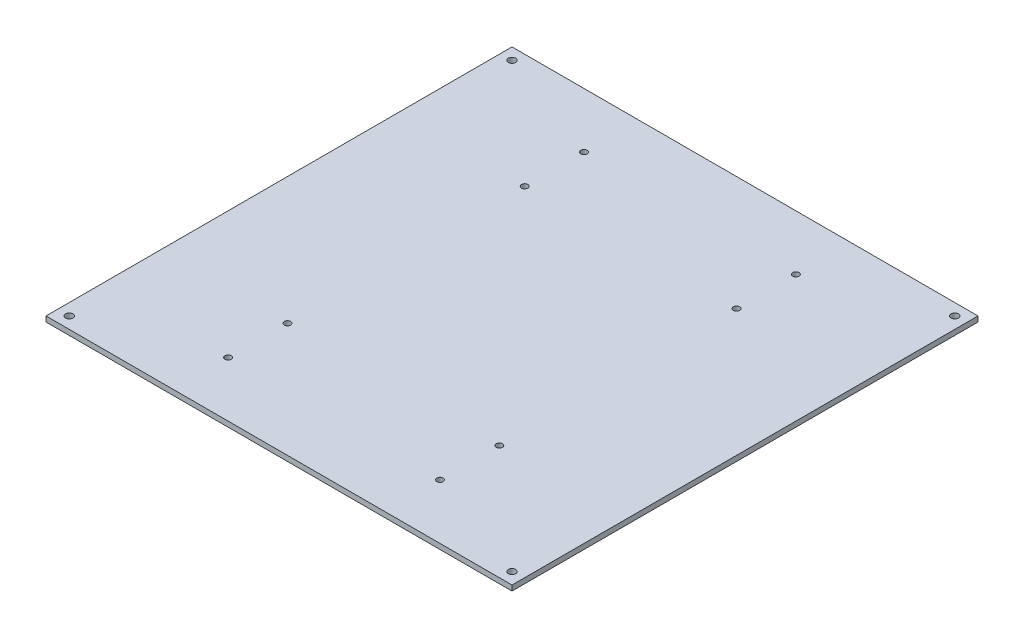
ISO-10303-21;
HEADER;
FILE_DESCRIPTION(('STEP AP214'),'2;1');
FILE_NAME('part.step','',(''),(''),'','','');
FILE_SCHEMA(('AUTOMOTIVE_DESIGN { 1 0 10303 214 1 1 1 1 }'));
ENDSEC;
DATA;
#1=APPLICATION_CONTEXT('core data for automotive mechanical design processes');
#2=APPLICATION_PROTOCOL_DEFINITION('international standard','automotive_design',2000,#1);
#3=PRODUCT_CONTEXT('',#1,'mechanical');
#4=PRODUCT('Part','Part','',(#3));
#5=PRODUCT_RELATED_PRODUCT_CATEGORY('part','',(#4));
#6=PRODUCT_DEFINITION_FORMATION('','',#4);
#7=PRODUCT_DEFINITION_CONTEXT('part definition',#1,'design');
#8=PRODUCT_DEFINITION('design','',#6,#7);
#9=PRODUCT_DEFINITION_SHAPE('','',#8);
#10=(LENGTH_UNIT() NAMED_UNIT(*) SI_UNIT(.MILLI.,.METRE.));
#11=(NAMED_UNIT(*) PLANE_ANGLE_UNIT() SI_UNIT($,.RADIAN.));
#12=(NAMED_UNIT(*) SI_UNIT($,.STERADIAN.) SOLID_ANGLE_UNIT());
#13=UNCERTAINTY_MEASURE_WITH_UNIT(LENGTH_MEASURE(1.E-05),#10,'distance_accuracy_value','');
#14=(GEOMETRIC_REPRESENTATION_CONTEXT(3) GLOBAL_UNCERTAINTY_ASSIGNED_CONTEXT((#13)) GLOBAL_UNIT_ASSIGNED_CONTEXT((#10,
#11,#12)) REPRESENTATION_CONTEXT('',''));
#15=CARTESIAN_POINT('',(0.,0.,0.));
#16=DIRECTION('',(0.,0.,1.));
#17=DIRECTION('',(1.,0.,0.));
#18=AXIS2_PLACEMENT_3D('',#15,#16,#17);
#19=CARTESIAN_POINT('',(0.,2.5,0.));
#20=DIRECTION('',(0.,-1.,0.));
#21=DIRECTION('',(0.,0.,-1.));
#22=AXIS2_PLACEMENT_3D('',#19,#20,#21);
#23=PLANE('',#22);
#24=CARTESIAN_POINT('',(60.,2.5,-54.));
#25=DIRECTION('',(0.,-1.,0.));
#26=DIRECTION('',(0.,0.,-1.));
#27=AXIS2_PLACEMENT_3D('',#24,#25,#26);
#28=CIRCLE('',#27,1.5);
#29=CARTESIAN_POINT('',(60.,2.5,-55.5));
#30=VERTEX_POINT('',#29);
#31=EDGE_CURVE('E146',#30,#30,#28,.T.);
#32=ORIENTED_EDGE('',*,*,#31,.T.);
#33=EDGE_LOOP('',(#32));
#34=FACE_BOUND('',#33,.T.);
#35=CARTESIAN_POINT('',(60.,2.5,-166.));
#36=DIRECTION('',(0.,-1.,0.));
#37=DIRECTION('',(0.,0.,1.));
#38=AXIS2_PLACEMENT_3D('',#35,#36,#37);
#39=CIRCLE('',#38,1.5);
#40=CARTESIAN_POINT('',(60.,2.5,-164.5));
#41=VERTEX_POINT('',#40);
#42=EDGE_CURVE('E165',#41,#41,#39,.T.);
#43=ORIENTED_EDGE('',*,*,#42,.T.);
#44=EDGE_LOOP('',(#43));
#45=FACE_BOUND('',#44,.T.);
#46=CARTESIAN_POINT('',(60.,2.5,-194.));
#47=DIRECTION('',(0.,-1.,0.));
#48=DIRECTION('',(0.,0.,1.));
#49=AXIS2_PLACEMENT_3D('',#46,#47,#48);
#50=CIRCLE('',#49,1.5);
#51=CARTESIAN_POINT('',(60.,2.5,-192.5));
#52=VERTEX_POINT('',#51);
#53=EDGE_CURVE('E159',#52,#52,#50,.T.);
#54=ORIENTED_EDGE('',*,*,#53,.T.);
#55=EDGE_LOOP('',(#54));
#56=FACE_BOUND('',#55,.T.);
#57=CARTESIAN_POINT('',(160.,2.5,-194.));
#58=DIRECTION('',(0.,-1.,0.));
#59=DIRECTION('',(0.,0.,-1.));
#60=AXIS2_PLACEMENT_3D('',#57,#58,#59);
#61=CIRCLE('',#60,1.5);
#62=CARTESIAN_POINT('',(160.,2.5,-195.5));
#63=VERTEX_POINT('',#62);
#64=EDGE_CURVE('E152',#63,#63,#61,.T.);
#65=ORIENTED_EDGE('',*,*,#64,.T.);
#66=EDGE_LOOP('',(#65));
#67=FACE_BOUND('',#66,.T.);
#68=CARTESIAN_POINT('',(160.,2.5,-166.));
#69=DIRECTION('',(0.,-1.,0.));
#70=DIRECTION('',(0.,0.,-1.));
#71=AXIS2_PLACEMENT_3D('',#68,#69,#70);
#72=CIRCLE('',#71,1.5);
#73=CARTESIAN_POINT('',(160.,2.5,-167.5));
#74=VERTEX_POINT('',#73);
#75=EDGE_CURVE('E153',#74,#74,#72,.T.);
#76=ORIENTED_EDGE('',*,*,#75,.T.);
#77=EDGE_LOOP('',(#76));
#78=FACE_BOUND('',#77,.T.);
#79=CARTESIAN_POINT('',(160.,2.5,-54.));
#80=DIRECTION('',(0.,-1.,0.));
#81=DIRECTION('',(0.,0.,1.));
#82=AXIS2_PLACEMENT_3D('',#79,#80,#81);
#83=CIRCLE('',#82,1.5);
#84=CARTESIAN_POINT('',(160.,2.5,-52.5));
#85=VERTEX_POINT('',#84);
#86=EDGE_CURVE('E182',#85,#85,#83,.T.);
#87=ORIENTED_EDGE('',*,*,#86,.T.);
#88=EDGE_LOOP('',(#87));
#89=FACE_BOUND('',#88,.T.);
#90=CARTESIAN_POINT('',(160.,2.5,-26.));
#91=DIRECTION('',(0.,-1.,0.));
#92=DIRECTION('',(0.,0.,1.));
#93=AXIS2_PLACEMENT_3D('',#90,#91,#92);
#94=CIRCLE('',#93,1.5);
#95=CARTESIAN_POINT('',(160.,2.5,-24.5));
#96=VERTEX_POINT('',#95);
#97=EDGE_CURVE('E176',#96,#96,#94,.T.);
#98=ORIENTED_EDGE('',*,*,#97,.T.);
#99=EDGE_LOOP('',(#98));
#100=FACE_BOUND('',#99,.T.);
#101=CARTESIAN_POINT('',(60.,2.5,-26.));
#102=DIRECTION('',(0.,-1.,0.));
#103=DIRECTION('',(0.,0.,-1.));
#104=AXIS2_PLACEMENT_3D('',#101,#102,#103);
#105=CIRCLE('',#104,1.5);
#106=CARTESIAN_POINT('',(60.,2.5,-27.5));
#107=VERTEX_POINT('',#106);
#108=EDGE_CURVE('E140',#107,#107,#105,.T.);
#109=ORIENTED_EDGE('',*,*,#108,.T.);
#110=EDGE_LOOP('',(#109));
#111=FACE_BOUND('',#110,.T.);
#112=DIRECTION('',(0.,0.,1.));
#113=VECTOR('',#112,1.);
#114=CARTESIAN_POINT('',(0.,2.5,0.));
#115=LINE('',#114,#113);
#116=CARTESIAN_POINT('',(0.,2.5,-220.));
#117=VERTEX_POINT('',#116);
#118=CARTESIAN_POINT('',(0.,2.5,0.));
#119=VERTEX_POINT('',#118);
#120=EDGE_CURVE('E92',#117,#119,#115,.T.);
#121=ORIENTED_EDGE('',*,*,#120,.T.);
#122=DIRECTION('',(1.,0.,0.));
#123=VECTOR('',#122,1.);
#124=CARTESIAN_POINT('',(0.,2.5,0.));
#125=LINE('',#124,#123);
#126=CARTESIAN_POINT('',(220.,2.5,0.));
#127=VERTEX_POINT('',#126);
#128=EDGE_CURVE('E87',#119,#127,#125,.T.);
#129=ORIENTED_EDGE('',*,*,#128,.T.);
#130=DIRECTION('',(0.,0.,-1.));
#131=VECTOR('',#130,1.);
#132=CARTESIAN_POINT('',(220.,2.5,0.));
#133=LINE('',#132,#131);
#134=CARTESIAN_POINT('',(220.,2.5,-220.));
#135=VERTEX_POINT('',#134);
#136=EDGE_CURVE('E90',#127,#135,#133,.T.);
#137=ORIENTED_EDGE('',*,*,#136,.T.);
#138=DIRECTION('',(-1.,0.,0.));
#139=VECTOR('',#138,1.);
#140=CARTESIAN_POINT('',(0.,2.5,-220.));
#141=LINE('',#140,#139);
#142=EDGE_CURVE('E57',#135,#117,#141,.T.);
#143=ORIENTED_EDGE('',*,*,#142,.T.);
#144=EDGE_LOOP('',(#121,#129,#137,#143));
#145=FACE_BOUND('',#144,.T.);
#146=CARTESIAN_POINT('',(5.50000000000003,2.5,-5.49999999999999));
#147=DIRECTION('',(0.,1.,0.));
#148=DIRECTION('',(0.,0.,1.));
#149=AXIS2_PLACEMENT_3D('',#146,#147,#148);
#150=CIRCLE('',#149,1.75);
#151=CARTESIAN_POINT('',(5.50000000000003,2.5,-3.74999999999999));
#152=VERTEX_POINT('',#151);
#153=EDGE_CURVE('E107',#152,#152,#150,.T.);
#154=ORIENTED_EDGE('',*,*,#153,.F.);
#155=EDGE_LOOP('',(#154));
#156=FACE_BOUND('',#155,.T.);
#157=CARTESIAN_POINT('',(214.5,2.5,-5.50000000000001));
#158=DIRECTION('',(0.,1.,0.));
#159=DIRECTION('',(0.,0.,1.));
#160=AXIS2_PLACEMENT_3D('',#157,#158,#159);
#161=CIRCLE('',#160,1.75000000000001);
#162=CARTESIAN_POINT('',(214.5,2.5,-3.74999999999999));
#163=VERTEX_POINT('',#162);
#164=EDGE_CURVE('E122',#163,#163,#161,.T.);
#165=ORIENTED_EDGE('',*,*,#164,.F.);
#166=EDGE_LOOP('',(#165));
#167=FACE_BOUND('',#166,.T.);
#168=CARTESIAN_POINT('',(214.5,2.5,-214.5));
#169=DIRECTION('',(0.,1.,0.));
#170=DIRECTION('',(0.,0.,1.));
#171=AXIS2_PLACEMENT_3D('',#168,#169,#170);
#172=CIRCLE('',#171,1.75000000000001);
#173=CARTESIAN_POINT('',(214.5,2.5,-212.75));
#174=VERTEX_POINT('',#173);
#175=EDGE_CURVE('E128',#174,#174,#172,.T.);
#176=ORIENTED_EDGE('',*,*,#175,.F.);
#177=EDGE_LOOP('',(#176));
#178=FACE_BOUND('',#177,.T.);
#179=CARTESIAN_POINT('',(5.50000000000001,2.5,-214.5));
#180=DIRECTION('',(0.,1.,0.));
#181=DIRECTION('',(0.,0.,1.));
#182=AXIS2_PLACEMENT_3D('',#179,#180,#181);
#183=CIRCLE('',#182,1.75);
#184=CARTESIAN_POINT('',(5.50000000000001,2.5,-212.75));
#185=VERTEX_POINT('',#184);
#186=EDGE_CURVE('E134',#185,#185,#183,.T.);
#187=ORIENTED_EDGE('',*,*,#186,.F.);
#188=EDGE_LOOP('',(#187));
#189=FACE_BOUND('',#188,.T.);
#190=ADVANCED_FACE('F40',(#34,#45,#56,#67,#78,#89,#100,#111,#145,#156,#167,#178,#189),#23,.F.);
#191=CARTESIAN_POINT('',(0.,0.,0.));
#192=DIRECTION('',(0.,-1.,0.));
#193=DIRECTION('',(0.,0.,-1.));
#194=AXIS2_PLACEMENT_3D('',#191,#192,#193);
#195=PLANE('',#194);
#196=CARTESIAN_POINT('',(60.,0.,-54.));
#197=DIRECTION('',(0.,-1.,0.));
#198=DIRECTION('',(0.,0.,-1.));
#199=AXIS2_PLACEMENT_3D('',#196,#197,#198);
#200=CIRCLE('',#199,1.5);
#201=CARTESIAN_POINT('',(60.,0.,-55.5));
#202=VERTEX_POINT('',#201);
#203=EDGE_CURVE('E168',#202,#202,#200,.T.);
#204=ORIENTED_EDGE('',*,*,#203,.F.);
#205=EDGE_LOOP('',(#204));
#206=FACE_BOUND('',#205,.T.);
#207=CARTESIAN_POINT('',(60.,0.,-166.));
#208=DIRECTION('',(0.,-1.,0.));
#209=DIRECTION('',(0.,0.,1.));
#210=AXIS2_PLACEMENT_3D('',#207,#208,#209);
#211=CIRCLE('',#210,1.5);
#212=CARTESIAN_POINT('',(60.,0.,-164.5));
#213=VERTEX_POINT('',#212);
#214=EDGE_CURVE('E162',#213,#213,#211,.T.);
#215=ORIENTED_EDGE('',*,*,#214,.F.);
#216=EDGE_LOOP('',(#215));
#217=FACE_BOUND('',#216,.T.);
#218=CARTESIAN_POINT('',(60.,0.,-194.));
#219=DIRECTION('',(0.,-1.,0.));
#220=DIRECTION('',(0.,0.,1.));
#221=AXIS2_PLACEMENT_3D('',#218,#219,#220);
#222=CIRCLE('',#221,1.5);
#223=CARTESIAN_POINT('',(60.,0.,-192.5));
#224=VERTEX_POINT('',#223);
#225=EDGE_CURVE('E156',#224,#224,#222,.T.);
#226=ORIENTED_EDGE('',*,*,#225,.F.);
#227=EDGE_LOOP('',(#226));
#228=FACE_BOUND('',#227,.T.);
#229=CARTESIAN_POINT('',(160.,0.,-194.));
#230=DIRECTION('',(0.,-1.,0.));
#231=DIRECTION('',(0.,0.,-1.));
#232=AXIS2_PLACEMENT_3D('',#229,#230,#231);
#233=CIRCLE('',#232,1.5);
#234=CARTESIAN_POINT('',(160.,0.,-195.5));
#235=VERTEX_POINT('',#234);
#236=EDGE_CURVE('E149',#235,#235,#233,.T.);
#237=ORIENTED_EDGE('',*,*,#236,.F.);
#238=EDGE_LOOP('',(#237));
#239=FACE_BOUND('',#238,.T.);
#240=CARTESIAN_POINT('',(160.,0.,-166.));
#241=DIRECTION('',(0.,-1.,0.));
#242=DIRECTION('',(0.,0.,-1.));
#243=AXIS2_PLACEMENT_3D('',#240,#241,#242);
#244=CIRCLE('',#243,1.5);
#245=CARTESIAN_POINT('',(160.,0.,-167.5));
#246=VERTEX_POINT('',#245);
#247=EDGE_CURVE('E185',#246,#246,#244,.T.);
#248=ORIENTED_EDGE('',*,*,#247,.F.);
#249=EDGE_LOOP('',(#248));
#250=FACE_BOUND('',#249,.T.);
#251=CARTESIAN_POINT('',(160.,0.,-54.));
#252=DIRECTION('',(0.,-1.,0.));
#253=DIRECTION('',(0.,0.,1.));
#254=AXIS2_PLACEMENT_3D('',#251,#252,#253);
#255=CIRCLE('',#254,1.5);
#256=CARTESIAN_POINT('',(160.,0.,-52.5));
#257=VERTEX_POINT('',#256);
#258=EDGE_CURVE('E179',#257,#257,#255,.T.);
#259=ORIENTED_EDGE('',*,*,#258,.F.);
#260=EDGE_LOOP('',(#259));
#261=FACE_BOUND('',#260,.T.);
#262=CARTESIAN_POINT('',(160.,0.,-26.));
#263=DIRECTION('',(0.,-1.,0.));
#264=DIRECTION('',(0.,0.,1.));
#265=AXIS2_PLACEMENT_3D('',#262,#263,#264);
#266=CIRCLE('',#265,1.5);
#267=CARTESIAN_POINT('',(160.,0.,-24.5));
#268=VERTEX_POINT('',#267);
#269=EDGE_CURVE('E173',#268,#268,#266,.T.);
#270=ORIENTED_EDGE('',*,*,#269,.F.);
#271=EDGE_LOOP('',(#270));
#272=FACE_BOUND('',#271,.T.);
#273=CARTESIAN_POINT('',(60.,0.,-26.));
#274=DIRECTION('',(0.,-1.,0.));
#275=DIRECTION('',(0.,0.,-1.));
#276=AXIS2_PLACEMENT_3D('',#273,#274,#275);
#277=CIRCLE('',#276,1.5);
#278=CARTESIAN_POINT('',(60.,0.,-27.5));
#279=VERTEX_POINT('',#278);
#280=EDGE_CURVE('E143',#279,#279,#277,.T.);
#281=ORIENTED_EDGE('',*,*,#280,.F.);
#282=EDGE_LOOP('',(#281));
#283=FACE_BOUND('',#282,.T.);
#284=CARTESIAN_POINT('',(214.5,0.,-214.5));
#285=DIRECTION('',(0.,1.,0.));
#286=DIRECTION('',(0.,0.,1.));
#287=AXIS2_PLACEMENT_3D('',#284,#285,#286);
#288=CIRCLE('',#287,1.75000000000001);
#289=CARTESIAN_POINT('',(214.5,0.,-212.75));
#290=VERTEX_POINT('',#289);
#291=EDGE_CURVE('E131',#290,#290,#288,.T.);
#292=ORIENTED_EDGE('',*,*,#291,.T.);
#293=EDGE_LOOP('',(#292));
#294=FACE_BOUND('',#293,.T.);
#295=CARTESIAN_POINT('',(5.50000000000003,0.,-5.49999999999999));
#296=DIRECTION('',(0.,1.,0.));
#297=DIRECTION('',(0.,0.,1.));
#298=AXIS2_PLACEMENT_3D('',#295,#296,#297);
#299=CIRCLE('',#298,1.75);
#300=CARTESIAN_POINT('',(5.50000000000003,0.,-3.74999999999999));
#301=VERTEX_POINT('',#300);
#302=EDGE_CURVE('E119',#301,#301,#299,.T.);
#303=ORIENTED_EDGE('',*,*,#302,.T.);
#304=EDGE_LOOP('',(#303));
#305=FACE_BOUND('',#304,.T.);
#306=DIRECTION('',(0.,0.,1.));
#307=VECTOR('',#306,1.);
#308=CARTESIAN_POINT('',(0.,0.,0.));
#309=LINE('',#308,#307);
#310=CARTESIAN_POINT('',(0.,0.,-220.));
#311=VERTEX_POINT('',#310);
#312=CARTESIAN_POINT('',(0.,0.,0.));
#313=VERTEX_POINT('',#312);
#314=EDGE_CURVE('E104',#311,#313,#309,.T.);
#315=ORIENTED_EDGE('',*,*,#314,.F.);
#316=DIRECTION('',(-1.,0.,0.));
#317=VECTOR('',#316,1.);
#318=CARTESIAN_POINT('',(0.,0.,-220.));
#319=LINE('',#318,#317);
#320=CARTESIAN_POINT('',(220.,0.,-220.));
#321=VERTEX_POINT('',#320);
#322=EDGE_CURVE('E80',#321,#311,#319,.T.);
#323=ORIENTED_EDGE('',*,*,#322,.F.);
#324=DIRECTION('',(0.,0.,-1.));
#325=VECTOR('',#324,1.);
#326=CARTESIAN_POINT('',(220.,0.,0.));
#327=LINE('',#326,#325);
#328=CARTESIAN_POINT('',(220.,0.,0.));
#329=VERTEX_POINT('',#328);
#330=EDGE_CURVE('E74',#329,#321,#327,.T.);
#331=ORIENTED_EDGE('',*,*,#330,.F.);
#332=DIRECTION('',(1.,0.,0.));
#333=VECTOR('',#332,1.);
#334=CARTESIAN_POINT('',(0.,0.,0.));
#335=LINE('',#334,#333);
#336=EDGE_CURVE('E96',#313,#329,#335,.T.);
#337=ORIENTED_EDGE('',*,*,#336,.F.);
#338=EDGE_LOOP('',(#315,#323,#331,#337));
#339=FACE_BOUND('',#338,.T.);
#340=CARTESIAN_POINT('',(214.5,0.,-5.50000000000001));
#341=DIRECTION('',(0.,1.,0.));
#342=DIRECTION('',(0.,0.,1.));
#343=AXIS2_PLACEMENT_3D('',#340,#341,#342);
#344=CIRCLE('',#343,1.75000000000001);
#345=CARTESIAN_POINT('',(214.5,0.,-3.74999999999999));
#346=VERTEX_POINT('',#345);
#347=EDGE_CURVE('E125',#346,#346,#344,.T.);
#348=ORIENTED_EDGE('',*,*,#347,.T.);
#349=EDGE_LOOP('',(#348));
#350=FACE_BOUND('',#349,.T.);
#351=CARTESIAN_POINT('',(5.50000000000001,0.,-214.5));
#352=DIRECTION('',(0.,1.,0.));
#353=DIRECTION('',(0.,0.,1.));
#354=AXIS2_PLACEMENT_3D('',#351,#352,#353);
#355=CIRCLE('',#354,1.75);
#356=CARTESIAN_POINT('',(5.50000000000001,0.,-212.75));
#357=VERTEX_POINT('',#356);
#358=EDGE_CURVE('E137',#357,#357,#355,.T.);
#359=ORIENTED_EDGE('',*,*,#358,.T.);
#360=EDGE_LOOP('',(#359));
#361=FACE_BOUND('',#360,.T.);
#362=ADVANCED_FACE('F115',(#206,#217,#228,#239,#250,#261,#272,#283,#294,#305,#339,#350,#361),
#195,.T.);
#363=CARTESIAN_POINT('',(0.,2.5,0.));
#364=DIRECTION('',(1.,0.,0.));
#365=DIRECTION('',(0.,0.,-1.));
#366=AXIS2_PLACEMENT_3D('',#363,#364,#365);
#367=PLANE('',#366);
#368=ORIENTED_EDGE('',*,*,#314,.T.);
#369=DIRECTION('',(0.,-1.,0.));
#370=VECTOR('',#369,1.);
#371=CARTESIAN_POINT('',(0.,2.5,0.));
#372=LINE('',#371,#370);
#373=EDGE_CURVE('E11',#119,#313,#372,.T.);
#374=ORIENTED_EDGE('',*,*,#373,.F.);
#375=ORIENTED_EDGE('',*,*,#120,.F.);
#376=DIRECTION('',(0.,-1.,0.));
#377=VECTOR('',#376,1.);
#378=CARTESIAN_POINT('',(0.,2.5,-220.));
#379=LINE('',#378,#377);
#380=EDGE_CURVE('E100',#117,#311,#379,.T.);
#381=ORIENTED_EDGE('',*,*,#380,.T.);
#382=EDGE_LOOP('',(#368,#374,#375,#381));
#383=FACE_BOUND('',#382,.T.);
#384=ADVANCED_FACE('F42',(#383),#367,.F.);
#385=CARTESIAN_POINT('',(0.,2.5,0.));
#386=DIRECTION('',(0.,0.,-1.));
#387=DIRECTION('',(-1.,0.,0.));
#388=AXIS2_PLACEMENT_3D('',#385,#386,#387);
#389=PLANE('',#388);
#390=ORIENTED_EDGE('',*,*,#336,.T.);
#391=DIRECTION('',(0.,-1.,0.));
#392=VECTOR('',#391,1.);
#393=CARTESIAN_POINT('',(220.,2.5,0.));
#394=LINE('',#393,#392);
#395=EDGE_CURVE('E49',#127,#329,#394,.T.);
#396=ORIENTED_EDGE('',*,*,#395,.F.);
#397=ORIENTED_EDGE('',*,*,#128,.F.);
#398=ORIENTED_EDGE('',*,*,#373,.T.);
#399=EDGE_LOOP('',(#390,#396,#397,#398));
#400=FACE_BOUND('',#399,.T.);
#401=ADVANCED_FACE('F95',(#400),#389,.F.);
#402=CARTESIAN_POINT('',(220.,2.5,0.));
#403=DIRECTION('',(-1.,0.,0.));
#404=DIRECTION('',(0.,0.,1.));
#405=AXIS2_PLACEMENT_3D('',#402,#403,#404);
#406=PLANE('',#405);
#407=ORIENTED_EDGE('',*,*,#330,.T.);
#408=DIRECTION('',(0.,-1.,0.));
#409=VECTOR('',#408,1.);
#410=CARTESIAN_POINT('',(220.,2.5,-220.));
#411=LINE('',#410,#409);
#412=EDGE_CURVE('E97',#135,#321,#411,.T.);
#413=ORIENTED_EDGE('',*,*,#412,.F.);
#414=ORIENTED_EDGE('',*,*,#136,.F.);
#415=ORIENTED_EDGE('',*,*,#395,.T.);
#416=EDGE_LOOP('',(#407,#413,#414,#415));
#417=FACE_BOUND('',#416,.T.);
#418=ADVANCED_FACE('F98',(#417),#406,.F.);
#419=CARTESIAN_POINT('',(0.,2.5,-220.));
#420=DIRECTION('',(0.,0.,1.));
#421=DIRECTION('',(1.,0.,0.));
#422=AXIS2_PLACEMENT_3D('',#419,#420,#421);
#423=PLANE('',#422);
#424=ORIENTED_EDGE('',*,*,#322,.T.);
#425=ORIENTED_EDGE('',*,*,#380,.F.);
#426=ORIENTED_EDGE('',*,*,#142,.F.);
#427=ORIENTED_EDGE('',*,*,#412,.T.);
#428=EDGE_LOOP('',(#424,#425,#426,#427));
#429=FACE_BOUND('',#428,.T.);
#430=ADVANCED_FACE('F112',(#429),#423,.F.);
#431=CARTESIAN_POINT('',(5.50000000000003,2.5,-5.49999999999999));
#432=DIRECTION('',(0.,-1.,0.));
#433=DIRECTION('',(0.,0.,-1.));
#434=AXIS2_PLACEMENT_3D('',#431,#432,#433);
#435=CYLINDRICAL_SURFACE('',#434,1.75);
#436=ORIENTED_EDGE('',*,*,#153,.T.);
#437=EDGE_LOOP('',(#436));
#438=FACE_BOUND('',#437,.T.);
#439=ORIENTED_EDGE('',*,*,#302,.F.);
#440=EDGE_LOOP('',(#439));
#441=FACE_BOUND('',#440,.T.);
#442=ADVANCED_FACE('F215',(#438,#441),#435,.F.);
#443=CARTESIAN_POINT('',(214.5,2.5,-5.50000000000001));
#444=DIRECTION('',(0.,-1.,0.));
#445=DIRECTION('',(0.,0.,-1.));
#446=AXIS2_PLACEMENT_3D('',#443,#444,#445);
#447=CYLINDRICAL_SURFACE('',#446,1.75000000000001);
#448=ORIENTED_EDGE('',*,*,#164,.T.);
#449=EDGE_LOOP('',(#448));
#450=FACE_BOUND('',#449,.T.);
#451=ORIENTED_EDGE('',*,*,#347,.F.);
#452=EDGE_LOOP('',(#451));
#453=FACE_BOUND('',#452,.T.);
#454=ADVANCED_FACE('F217',(#450,#453),#447,.F.);
#455=CARTESIAN_POINT('',(214.5,2.5,-214.5));
#456=DIRECTION('',(0.,-1.,0.));
#457=DIRECTION('',(0.,0.,-1.));
#458=AXIS2_PLACEMENT_3D('',#455,#456,#457);
#459=CYLINDRICAL_SURFACE('',#458,1.75000000000001);
#460=ORIENTED_EDGE('',*,*,#175,.T.);
#461=EDGE_LOOP('',(#460));
#462=FACE_BOUND('',#461,.T.);
#463=ORIENTED_EDGE('',*,*,#291,.F.);
#464=EDGE_LOOP('',(#463));
#465=FACE_BOUND('',#464,.T.);
#466=ADVANCED_FACE('F224',(#462,#465),#459,.F.);
#467=CARTESIAN_POINT('',(5.50000000000001,2.5,-214.5));
#468=DIRECTION('',(0.,-1.,0.));
#469=DIRECTION('',(0.,0.,-1.));
#470=AXIS2_PLACEMENT_3D('',#467,#468,#469);
#471=CYLINDRICAL_SURFACE('',#470,1.75);
#472=ORIENTED_EDGE('',*,*,#186,.T.);
#473=EDGE_LOOP('',(#472));
#474=FACE_BOUND('',#473,.T.);
#475=ORIENTED_EDGE('',*,*,#358,.F.);
#476=EDGE_LOOP('',(#475));
#477=FACE_BOUND('',#476,.T.);
#478=ADVANCED_FACE('F260',(#474,#477),#471,.F.);
#479=CARTESIAN_POINT('',(60.,2.5,-26.));
#480=DIRECTION('',(0.,-1.,0.));
#481=DIRECTION('',(0.,0.,-1.));
#482=AXIS2_PLACEMENT_3D('',#479,#480,#481);
#483=CYLINDRICAL_SURFACE('',#482,1.5);
#484=ORIENTED_EDGE('',*,*,#108,.F.);
#485=EDGE_LOOP('',(#484));
#486=FACE_BOUND('',#485,.T.);
#487=ORIENTED_EDGE('',*,*,#280,.T.);
#488=EDGE_LOOP('',(#487));
#489=FACE_BOUND('',#488,.T.);
#490=ADVANCED_FACE('F254',(#486,#489),#483,.F.);
#491=CARTESIAN_POINT('',(160.,2.5,-26.));
#492=DIRECTION('',(0.,-1.,0.));
#493=DIRECTION('',(0.,0.,-1.));
#494=AXIS2_PLACEMENT_3D('',#491,#492,#493);
#495=CYLINDRICAL_SURFACE('',#494,1.5);
#496=ORIENTED_EDGE('',*,*,#97,.F.);
#497=EDGE_LOOP('',(#496));
#498=FACE_BOUND('',#497,.T.);
#499=ORIENTED_EDGE('',*,*,#269,.T.);
#500=EDGE_LOOP('',(#499));
#501=FACE_BOUND('',#500,.T.);
#502=ADVANCED_FACE('F259',(#498,#501),#495,.F.);
#503=CARTESIAN_POINT('',(160.,2.5,-54.));
#504=DIRECTION('',(0.,-1.,0.));
#505=DIRECTION('',(0.,0.,-1.));
#506=AXIS2_PLACEMENT_3D('',#503,#504,#505);
#507=CYLINDRICAL_SURFACE('',#506,1.5);
#508=ORIENTED_EDGE('',*,*,#86,.F.);
#509=EDGE_LOOP('',(#508));
#510=FACE_BOUND('',#509,.T.);
#511=ORIENTED_EDGE('',*,*,#258,.T.);
#512=EDGE_LOOP('',(#511));
#513=FACE_BOUND('',#512,.T.);
#514=ADVANCED_FACE('F197',(#510,#513),#507,.F.);
#515=CARTESIAN_POINT('',(160.,2.5,-166.));
#516=DIRECTION('',(0.,-1.,0.));
#517=DIRECTION('',(0.,0.,-1.));
#518=AXIS2_PLACEMENT_3D('',#515,#516,#517);
#519=CYLINDRICAL_SURFACE('',#518,1.5);
#520=ORIENTED_EDGE('',*,*,#75,.F.);
#521=EDGE_LOOP('',(#520));
#522=FACE_BOUND('',#521,.T.);
#523=ORIENTED_EDGE('',*,*,#247,.T.);
#524=EDGE_LOOP('',(#523));
#525=FACE_BOUND('',#524,.T.);
#526=ADVANCED_FACE('F193',(#522,#525),#519,.F.);
#527=CARTESIAN_POINT('',(160.,2.5,-194.));
#528=DIRECTION('',(0.,-1.,0.));
#529=DIRECTION('',(0.,0.,-1.));
#530=AXIS2_PLACEMENT_3D('',#527,#528,#529);
#531=CYLINDRICAL_SURFACE('',#530,1.5);
#532=ORIENTED_EDGE('',*,*,#64,.F.);
#533=EDGE_LOOP('',(#532));
#534=FACE_BOUND('',#533,.T.);
#535=ORIENTED_EDGE('',*,*,#236,.T.);
#536=EDGE_LOOP('',(#535));
#537=FACE_BOUND('',#536,.T.);
#538=ADVANCED_FACE('F196',(#534,#537),#531,.F.);
#539=CARTESIAN_POINT('',(60.,2.5,-194.));
#540=DIRECTION('',(0.,-1.,0.));
#541=DIRECTION('',(0.,0.,-1.));
#542=AXIS2_PLACEMENT_3D('',#539,#540,#541);
#543=CYLINDRICAL_SURFACE('',#542,1.5);
#544=ORIENTED_EDGE('',*,*,#53,.F.);
#545=EDGE_LOOP('',(#544));
#546=FACE_BOUND('',#545,.T.);
#547=ORIENTED_EDGE('',*,*,#225,.T.);
#548=EDGE_LOOP('',(#547));
#549=FACE_BOUND('',#548,.T.);
#550=ADVANCED_FACE('F296',(#546,#549),#543,.F.);
#551=CARTESIAN_POINT('',(60.,2.5,-166.));
#552=DIRECTION('',(0.,-1.,0.));
#553=DIRECTION('',(0.,0.,-1.));
#554=AXIS2_PLACEMENT_3D('',#551,#552,#553);
#555=CYLINDRICAL_SURFACE('',#554,1.5);
#556=ORIENTED_EDGE('',*,*,#42,.F.);
#557=EDGE_LOOP('',(#556));
#558=FACE_BOUND('',#557,.T.);
#559=ORIENTED_EDGE('',*,*,#214,.T.);
#560=EDGE_LOOP('',(#559));
#561=FACE_BOUND('',#560,.T.);
#562=ADVANCED_FACE('F306',(#558,#561),#555,.F.);
#563=CARTESIAN_POINT('',(60.,2.5,-54.));
#564=DIRECTION('',(0.,-1.,0.));
#565=DIRECTION('',(0.,0.,-1.));
#566=AXIS2_PLACEMENT_3D('',#563,#564,#565);
#567=CYLINDRICAL_SURFACE('',#566,1.5);
#568=ORIENTED_EDGE('',*,*,#31,.F.);
#569=EDGE_LOOP('',(#568));
#570=FACE_BOUND('',#569,.T.);
#571=ORIENTED_EDGE('',*,*,#203,.T.);
#572=EDGE_LOOP('',(#571));
#573=FACE_BOUND('',#572,.T.);
#574=ADVANCED_FACE('F316',(#570,#573),#567,.F.);
#575=CLOSED_SHELL('',(#190,#362,#384,#401,#418,#430,#442,#454,#466,#478,#490,#502,#514,#526,
#538,#550,#562,#574));
#576=MANIFOLD_SOLID_BREP('B2',#575);
#577=ADVANCED_BREP_SHAPE_REPRESENTATION('',(#18,#576),#14);
#578=SHAPE_DEFINITION_REPRESENTATION(#9,#577);
ENDSEC;
END-ISO-10303-21;
